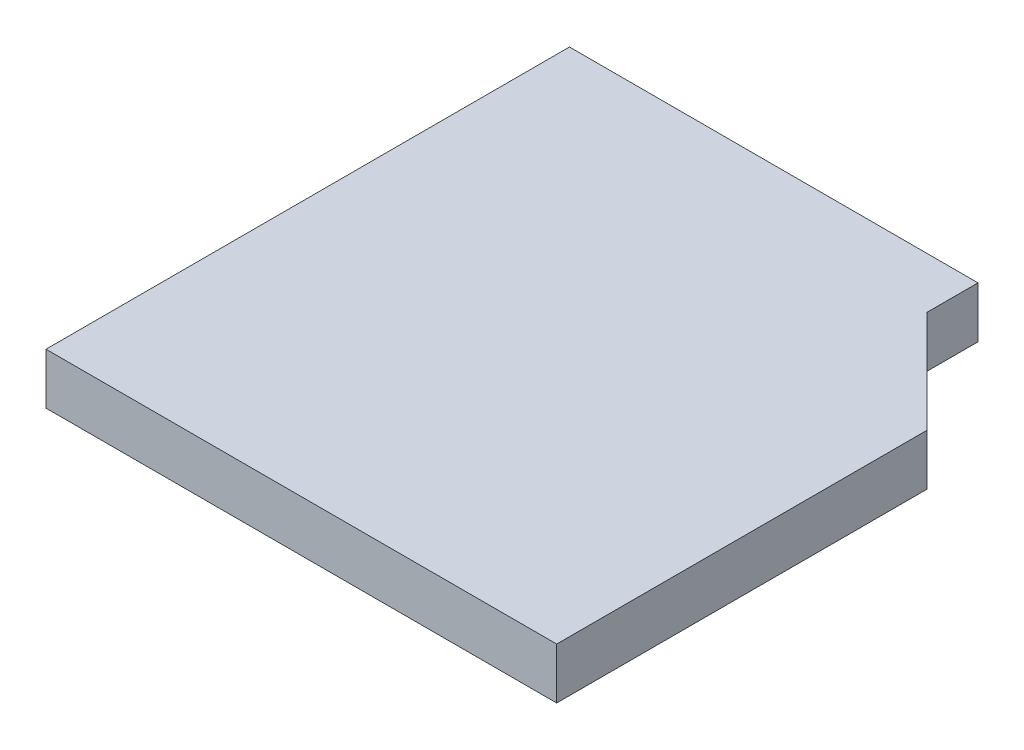
ISO-10303-21;
HEADER;
FILE_DESCRIPTION(('STEP AP214'),'2;1');
FILE_NAME('part.step','',(''),(''),'','','');
FILE_SCHEMA(('AUTOMOTIVE_DESIGN { 1 0 10303 214 1 1 1 1 }'));
ENDSEC;
DATA;
#1=APPLICATION_CONTEXT('core data for automotive mechanical design processes');
#2=APPLICATION_PROTOCOL_DEFINITION('international standard','automotive_design',2000,#1);
#3=PRODUCT_CONTEXT('',#1,'mechanical');
#4=PRODUCT('Part','Part','',(#3));
#5=PRODUCT_RELATED_PRODUCT_CATEGORY('part','',(#4));
#6=PRODUCT_DEFINITION_FORMATION('','',#4);
#7=PRODUCT_DEFINITION_CONTEXT('part definition',#1,'design');
#8=PRODUCT_DEFINITION('design','',#6,#7);
#9=PRODUCT_DEFINITION_SHAPE('','',#8);
#10=(LENGTH_UNIT() NAMED_UNIT(*) SI_UNIT(.MILLI.,.METRE.));
#11=(NAMED_UNIT(*) PLANE_ANGLE_UNIT() SI_UNIT($,.RADIAN.));
#12=(NAMED_UNIT(*) SI_UNIT($,.STERADIAN.) SOLID_ANGLE_UNIT());
#13=UNCERTAINTY_MEASURE_WITH_UNIT(LENGTH_MEASURE(1.E-05),#10,'distance_accuracy_value','');
#14=(GEOMETRIC_REPRESENTATION_CONTEXT(3) GLOBAL_UNCERTAINTY_ASSIGNED_CONTEXT((#13)) GLOBAL_UNIT_ASSIGNED_CONTEXT((#10,
#11,#12)) REPRESENTATION_CONTEXT('',''));
#15=CARTESIAN_POINT('',(0.,0.,0.));
#16=DIRECTION('',(0.,0.,1.));
#17=DIRECTION('',(1.,0.,0.));
#18=AXIS2_PLACEMENT_3D('',#15,#16,#17);
#19=CARTESIAN_POINT('',(0.,12.7,0.));
#20=DIRECTION('',(1.,0.,0.));
#21=DIRECTION('',(0.,0.,-1.));
#22=AXIS2_PLACEMENT_3D('',#19,#20,#21);
#23=PLANE('',#22);
#24=DIRECTION('',(0.,0.,1.));
#25=VECTOR('',#24,1.);
#26=CARTESIAN_POINT('',(0.,0.,0.));
#27=LINE('',#26,#25);
#28=CARTESIAN_POINT('',(0.,0.,-130.175));
#29=VERTEX_POINT('',#28);
#30=CARTESIAN_POINT('',(0.,0.,0.));
#31=VERTEX_POINT('',#30);
#32=EDGE_CURVE('E121',#29,#31,#27,.T.);
#33=ORIENTED_EDGE('',*,*,#32,.T.);
#34=DIRECTION('',(0.,-1.,0.));
#35=VECTOR('',#34,1.);
#36=CARTESIAN_POINT('',(0.,12.7,0.));
#37=LINE('',#36,#35);
#38=CARTESIAN_POINT('',(0.,12.7,0.));
#39=VERTEX_POINT('',#38);
#40=EDGE_CURVE('E11',#39,#31,#37,.T.);
#41=ORIENTED_EDGE('',*,*,#40,.F.);
#42=DIRECTION('',(0.,0.,1.));
#43=VECTOR('',#42,1.);
#44=CARTESIAN_POINT('',(0.,12.7,0.));
#45=LINE('',#44,#43);
#46=CARTESIAN_POINT('',(0.,12.7,-130.175));
#47=VERTEX_POINT('',#46);
#48=EDGE_CURVE('E133',#47,#39,#45,.T.);
#49=ORIENTED_EDGE('',*,*,#48,.F.);
#50=DIRECTION('',(0.,-1.,0.));
#51=VECTOR('',#50,1.);
#52=CARTESIAN_POINT('',(0.,12.7,-130.175));
#53=LINE('',#52,#51);
#54=EDGE_CURVE('E116',#47,#29,#53,.T.);
#55=ORIENTED_EDGE('',*,*,#54,.T.);
#56=EDGE_LOOP('',(#33,#41,#49,#55));
#57=FACE_BOUND('',#56,.T.);
#58=ADVANCED_FACE('F39',(#57),#23,.F.);
#59=CARTESIAN_POINT('',(0.,12.7,0.));
#60=DIRECTION('',(0.,0.,-1.));
#61=DIRECTION('',(-1.,0.,0.));
#62=AXIS2_PLACEMENT_3D('',#59,#60,#61);
#63=PLANE('',#62);
#64=DIRECTION('',(1.,0.,0.));
#65=VECTOR('',#64,1.);
#66=CARTESIAN_POINT('',(0.,0.,0.));
#67=LINE('',#66,#65);
#68=CARTESIAN_POINT('',(127.,0.,0.));
#69=VERTEX_POINT('',#68);
#70=EDGE_CURVE('E128',#31,#69,#67,.T.);
#71=ORIENTED_EDGE('',*,*,#70,.T.);
#72=DIRECTION('',(0.,-1.,0.));
#73=VECTOR('',#72,1.);
#74=CARTESIAN_POINT('',(127.,12.7,0.));
#75=LINE('',#74,#73);
#76=CARTESIAN_POINT('',(127.,12.7,0.));
#77=VERTEX_POINT('',#76);
#78=EDGE_CURVE('E50',#77,#69,#75,.T.);
#79=ORIENTED_EDGE('',*,*,#78,.F.);
#80=DIRECTION('',(1.,0.,0.));
#81=VECTOR('',#80,1.);
#82=CARTESIAN_POINT('',(0.,12.7,0.));
#83=LINE('',#82,#81);
#84=EDGE_CURVE('E95',#39,#77,#83,.T.);
#85=ORIENTED_EDGE('',*,*,#84,.F.);
#86=ORIENTED_EDGE('',*,*,#40,.T.);
#87=EDGE_LOOP('',(#71,#79,#85,#86));
#88=FACE_BOUND('',#87,.T.);
#89=ADVANCED_FACE('F160',(#88),#63,.F.);
#90=CARTESIAN_POINT('',(127.,12.7,0.));
#91=DIRECTION('',(-1.,0.,0.));
#92=DIRECTION('',(0.,0.,1.));
#93=AXIS2_PLACEMENT_3D('',#90,#91,#92);
#94=PLANE('',#93);
#95=DIRECTION('',(0.,0.,-1.));
#96=VECTOR('',#95,1.);
#97=CARTESIAN_POINT('',(127.,0.,0.));
#98=LINE('',#97,#96);
#99=CARTESIAN_POINT('',(127.,0.,-92.0750000000001));
#100=VERTEX_POINT('',#99);
#101=EDGE_CURVE('E126',#69,#100,#98,.T.);
#102=ORIENTED_EDGE('',*,*,#101,.T.);
#103=DIRECTION('',(0.,-1.,0.));
#104=VECTOR('',#103,1.);
#105=CARTESIAN_POINT('',(127.,12.7,-92.0750000000001));
#106=LINE('',#105,#104);
#107=CARTESIAN_POINT('',(127.,12.7,-92.0750000000001));
#108=VERTEX_POINT('',#107);
#109=EDGE_CURVE('E114',#108,#100,#106,.T.);
#110=ORIENTED_EDGE('',*,*,#109,.F.);
#111=DIRECTION('',(0.,0.,-1.));
#112=VECTOR('',#111,1.);
#113=CARTESIAN_POINT('',(127.,12.7,0.));
#114=LINE('',#113,#112);
#115=EDGE_CURVE('E103',#77,#108,#114,.T.);
#116=ORIENTED_EDGE('',*,*,#115,.F.);
#117=ORIENTED_EDGE('',*,*,#78,.T.);
#118=EDGE_LOOP('',(#102,#110,#116,#117));
#119=FACE_BOUND('',#118,.T.);
#120=ADVANCED_FACE('F137',(#119),#94,.F.);
#121=CARTESIAN_POINT('',(101.6,12.7,-117.475));
#122=DIRECTION('',(-0.707106781186546,0.,0.707106781186549));
#123=DIRECTION('',(0.707106781186549,0.,0.707106781186546));
#124=AXIS2_PLACEMENT_3D('',#121,#122,#123);
#125=PLANE('',#124);
#126=DIRECTION('',(-0.707106781186549,0.,-0.707106781186546));
#127=VECTOR('',#126,1.);
#128=CARTESIAN_POINT('',(101.6,0.,-117.475));
#129=LINE('',#128,#127);
#130=CARTESIAN_POINT('',(101.6,0.,-117.475));
#131=VERTEX_POINT('',#130);
#132=EDGE_CURVE('E111',#100,#131,#129,.T.);
#133=ORIENTED_EDGE('',*,*,#132,.T.);
#134=DIRECTION('',(0.,-1.,0.));
#135=VECTOR('',#134,1.);
#136=CARTESIAN_POINT('',(101.6,12.7,-117.475));
#137=LINE('',#136,#135);
#138=CARTESIAN_POINT('',(101.6,12.7,-117.475));
#139=VERTEX_POINT('',#138);
#140=EDGE_CURVE('E108',#139,#131,#137,.T.);
#141=ORIENTED_EDGE('',*,*,#140,.F.);
#142=DIRECTION('',(-0.707106781186549,0.,-0.707106781186546));
#143=VECTOR('',#142,1.);
#144=CARTESIAN_POINT('',(101.6,12.7,-117.475));
#145=LINE('',#144,#143);
#146=EDGE_CURVE('E98',#108,#139,#145,.T.);
#147=ORIENTED_EDGE('',*,*,#146,.F.);
#148=ORIENTED_EDGE('',*,*,#109,.T.);
#149=EDGE_LOOP('',(#133,#141,#147,#148));
#150=FACE_BOUND('',#149,.T.);
#151=ADVANCED_FACE('F112',(#150),#125,.F.);
#152=CARTESIAN_POINT('',(101.6,12.7,-130.175));
#153=DIRECTION('',(-1.,0.,0.));
#154=DIRECTION('',(0.,0.,1.));
#155=AXIS2_PLACEMENT_3D('',#152,#153,#154);
#156=PLANE('',#155);
#157=DIRECTION('',(0.,0.,-1.));
#158=VECTOR('',#157,1.);
#159=CARTESIAN_POINT('',(101.6,0.,-130.175));
#160=LINE('',#159,#158);
#161=CARTESIAN_POINT('',(101.6,0.,-130.175));
#162=VERTEX_POINT('',#161);
#163=EDGE_CURVE('E76',#131,#162,#160,.T.);
#164=ORIENTED_EDGE('',*,*,#163,.T.);
#165=DIRECTION('',(0.,-1.,0.));
#166=VECTOR('',#165,1.);
#167=CARTESIAN_POINT('',(101.6,12.7,-130.175));
#168=LINE('',#167,#166);
#169=CARTESIAN_POINT('',(101.6,12.7,-130.175));
#170=VERTEX_POINT('',#169);
#171=EDGE_CURVE('E113',#170,#162,#168,.T.);
#172=ORIENTED_EDGE('',*,*,#171,.F.);
#173=DIRECTION('',(0.,0.,-1.));
#174=VECTOR('',#173,1.);
#175=CARTESIAN_POINT('',(101.6,12.7,-130.175));
#176=LINE('',#175,#174);
#177=EDGE_CURVE('E104',#139,#170,#176,.T.);
#178=ORIENTED_EDGE('',*,*,#177,.F.);
#179=ORIENTED_EDGE('',*,*,#140,.T.);
#180=EDGE_LOOP('',(#164,#172,#178,#179));
#181=FACE_BOUND('',#180,.T.);
#182=ADVANCED_FACE('F119',(#181),#156,.F.);
#183=CARTESIAN_POINT('',(0.,12.7,-130.175));
#184=DIRECTION('',(0.,0.,1.));
#185=DIRECTION('',(1.,0.,0.));
#186=AXIS2_PLACEMENT_3D('',#183,#184,#185);
#187=PLANE('',#186);
#188=DIRECTION('',(-1.,0.,0.));
#189=VECTOR('',#188,1.);
#190=CARTESIAN_POINT('',(0.,0.,-130.175));
#191=LINE('',#190,#189);
#192=EDGE_CURVE('E84',#162,#29,#191,.T.);
#193=ORIENTED_EDGE('',*,*,#192,.T.);
#194=ORIENTED_EDGE('',*,*,#54,.F.);
#195=DIRECTION('',(-1.,0.,0.));
#196=VECTOR('',#195,1.);
#197=CARTESIAN_POINT('',(0.,12.7,-130.175));
#198=LINE('',#197,#196);
#199=EDGE_CURVE('E54',#170,#47,#198,.T.);
#200=ORIENTED_EDGE('',*,*,#199,.F.);
#201=ORIENTED_EDGE('',*,*,#171,.T.);
#202=EDGE_LOOP('',(#193,#194,#200,#201));
#203=FACE_BOUND('',#202,.T.);
#204=ADVANCED_FACE('F147',(#203),#187,.F.);
#205=CARTESIAN_POINT('',(0.,12.7,0.));
#206=DIRECTION('',(0.,-1.,0.));
#207=DIRECTION('',(0.,0.,-1.));
#208=AXIS2_PLACEMENT_3D('',#205,#206,#207);
#209=PLANE('',#208);
#210=ORIENTED_EDGE('',*,*,#48,.T.);
#211=ORIENTED_EDGE('',*,*,#84,.T.);
#212=ORIENTED_EDGE('',*,*,#115,.T.);
#213=ORIENTED_EDGE('',*,*,#146,.T.);
#214=ORIENTED_EDGE('',*,*,#177,.T.);
#215=ORIENTED_EDGE('',*,*,#199,.T.);
#216=EDGE_LOOP('',(#210,#211,#212,#213,#214,#215));
#217=FACE_BOUND('',#216,.T.);
#218=ADVANCED_FACE('F102',(#217),#209,.F.);
#219=CARTESIAN_POINT('',(0.,0.,0.));
#220=DIRECTION('',(0.,-1.,0.));
#221=DIRECTION('',(0.,0.,-1.));
#222=AXIS2_PLACEMENT_3D('',#219,#220,#221);
#223=PLANE('',#222);
#224=ORIENTED_EDGE('',*,*,#32,.F.);
#225=ORIENTED_EDGE('',*,*,#192,.F.);
#226=ORIENTED_EDGE('',*,*,#163,.F.);
#227=ORIENTED_EDGE('',*,*,#132,.F.);
#228=ORIENTED_EDGE('',*,*,#101,.F.);
#229=ORIENTED_EDGE('',*,*,#70,.F.);
#230=EDGE_LOOP('',(#224,#225,#226,#227,#228,#229));
#231=FACE_BOUND('',#230,.T.);
#232=ADVANCED_FACE('F145',(#231),#223,.T.);
#233=CLOSED_SHELL('',(#58,#89,#120,#151,#182,#204,#218,#232));
#234=MANIFOLD_SOLID_BREP('B2',#233);
#235=ADVANCED_BREP_SHAPE_REPRESENTATION('',(#18,#234),#14);
#236=SHAPE_DEFINITION_REPRESENTATION(#9,#235);
ENDSEC;
END-ISO-10303-21;
